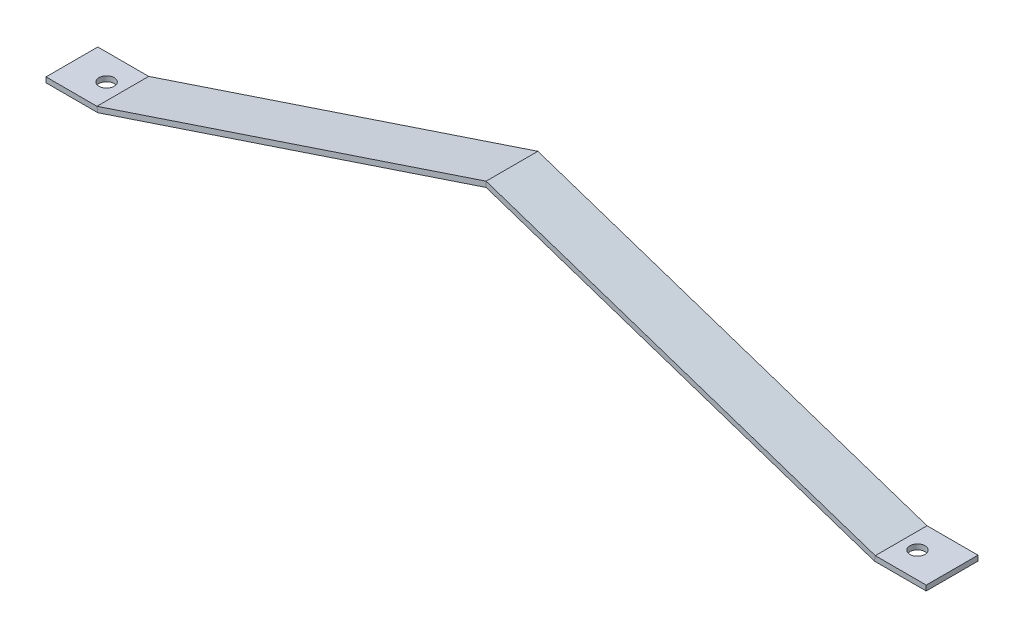
ISO-10303-21;
HEADER;
FILE_DESCRIPTION(('STEP AP214'),'2;1');
FILE_NAME('part.step','',(''),(''),'','','');
FILE_SCHEMA(('AUTOMOTIVE_DESIGN { 1 0 10303 214 1 1 1 1 }'));
ENDSEC;
DATA;
#1=APPLICATION_CONTEXT('core data for automotive mechanical design processes');
#2=APPLICATION_PROTOCOL_DEFINITION('international standard','automotive_design',2000,#1);
#3=PRODUCT_CONTEXT('',#1,'mechanical');
#4=PRODUCT('Part','Part','',(#3));
#5=PRODUCT_RELATED_PRODUCT_CATEGORY('part','',(#4));
#6=PRODUCT_DEFINITION_FORMATION('','',#4);
#7=PRODUCT_DEFINITION_CONTEXT('part definition',#1,'design');
#8=PRODUCT_DEFINITION('design','',#6,#7);
#9=PRODUCT_DEFINITION_SHAPE('','',#8);
#10=(LENGTH_UNIT() NAMED_UNIT(*) SI_UNIT(.MILLI.,.METRE.));
#11=(NAMED_UNIT(*) PLANE_ANGLE_UNIT() SI_UNIT($,.RADIAN.));
#12=(NAMED_UNIT(*) SI_UNIT($,.STERADIAN.) SOLID_ANGLE_UNIT());
#13=UNCERTAINTY_MEASURE_WITH_UNIT(LENGTH_MEASURE(1.E-05),#10,'distance_accuracy_value','');
#14=(GEOMETRIC_REPRESENTATION_CONTEXT(3) GLOBAL_UNCERTAINTY_ASSIGNED_CONTEXT((#13)) GLOBAL_UNIT_ASSIGNED_CONTEXT((#10,
#11,#12)) REPRESENTATION_CONTEXT('',''));
#15=CARTESIAN_POINT('',(0.,0.,0.));
#16=DIRECTION('',(0.,0.,1.));
#17=DIRECTION('',(1.,0.,0.));
#18=AXIS2_PLACEMENT_3D('',#15,#16,#17);
#19=CARTESIAN_POINT('',(-40.6812185256828,0.253999999999998,0.));
#20=DIRECTION('',(0.,-1.,0.));
#21=DIRECTION('',(1.,0.,0.));
#22=AXIS2_PLACEMENT_3D('',#19,#20,#21);
#23=PLANE('',#22);
#24=CARTESIAN_POINT('',(-41.4782,0.253999999999998,-1.27));
#25=DIRECTION('',(0.,-1.,0.));
#26=DIRECTION('',(1.,0.,0.));
#27=AXIS2_PLACEMENT_3D('',#24,#25,#26);
#28=CIRCLE('',#27,0.370839999999997);
#29=CARTESIAN_POINT('',(-41.10736,0.253999999999998,-1.27));
#30=VERTEX_POINT('',#29);
#31=EDGE_CURVE('E319',#30,#30,#28,.T.);
#32=ORIENTED_EDGE('',*,*,#31,.T.);
#33=EDGE_LOOP('',(#32));
#34=FACE_BOUND('',#33,.T.);
#35=DIRECTION('',(0.,0.,-1.));
#36=VECTOR('',#35,1.);
#37=CARTESIAN_POINT('',(-43.18,0.253999999999998,0.));
#38=LINE('',#37,#36);
#39=CARTESIAN_POINT('',(-43.18,0.253999999999999,0.));
#40=VERTEX_POINT('',#39);
#41=CARTESIAN_POINT('',(-43.18,0.253999999999998,-2.54));
#42=VERTEX_POINT('',#41);
#43=EDGE_CURVE('E46',#40,#42,#38,.T.);
#44=ORIENTED_EDGE('',*,*,#43,.F.);
#45=DIRECTION('',(-1.,0.,0.));
#46=VECTOR('',#45,1.);
#47=CARTESIAN_POINT('',(-40.6812185256828,0.253999999999999,0.));
#48=LINE('',#47,#46);
#49=CARTESIAN_POINT('',(-40.6812185256828,0.253999999999999,0.));
#50=VERTEX_POINT('',#49);
#51=EDGE_CURVE('E185',#50,#40,#48,.T.);
#52=ORIENTED_EDGE('',*,*,#51,.F.);
#53=DIRECTION('',(0.,0.,1.));
#54=VECTOR('',#53,1.);
#55=CARTESIAN_POINT('',(-40.6812185256828,0.253999999999998,0.));
#56=LINE('',#55,#54);
#57=CARTESIAN_POINT('',(-40.6812185256828,0.253999999999998,-2.54));
#58=VERTEX_POINT('',#57);
#59=EDGE_CURVE('E181',#58,#50,#56,.T.);
#60=ORIENTED_EDGE('',*,*,#59,.F.);
#61=DIRECTION('',(-1.,0.,0.));
#62=VECTOR('',#61,1.);
#63=CARTESIAN_POINT('',(-40.6812185256828,0.253999999999998,-2.54));
#64=LINE('',#63,#62);
#65=EDGE_CURVE('E194',#58,#42,#64,.T.);
#66=ORIENTED_EDGE('',*,*,#65,.T.);
#67=EDGE_LOOP('',(#44,#52,#60,#66));
#68=FACE_BOUND('',#67,.T.);
#69=ADVANCED_FACE('F37',(#34,#68),#23,.F.);
#70=CARTESIAN_POINT('',(-40.0879069353081,-3.40215075888503,0.));
#71=DIRECTION('',(0.,0.,-1.));
#72=DIRECTION('',(-1.,0.,0.));
#73=AXIS2_PLACEMENT_3D('',#70,#71,#72);
#74=PLANE('',#73);
#75=DIRECTION('',(0.,1.,0.));
#76=VECTOR('',#75,1.);
#77=CARTESIAN_POINT('',(-43.18,-3.40215075888503,0.));
#78=LINE('',#77,#76);
#79=CARTESIAN_POINT('',(-43.18,0.,0.));
#80=VERTEX_POINT('',#79);
#81=EDGE_CURVE('E200',#80,#40,#78,.T.);
#82=ORIENTED_EDGE('',*,*,#81,.F.);
#83=DIRECTION('',(-1.,0.,0.));
#84=VECTOR('',#83,1.);
#85=CARTESIAN_POINT('',(-40.64,0.,0.));
#86=LINE('',#85,#84);
#87=CARTESIAN_POINT('',(-40.64,0.,0.));
#88=VERTEX_POINT('',#87);
#89=EDGE_CURVE('E188',#88,#80,#86,.T.);
#90=ORIENTED_EDGE('',*,*,#89,.F.);
#91=DIRECTION('',(0.160182243006967,-0.987087457637497,0.));
#92=VECTOR('',#91,1.);
#93=CARTESIAN_POINT('',(-40.0879069353081,-3.40215075888503,0.));
#94=LINE('',#93,#92);
#95=EDGE_CURVE('E184',#50,#88,#94,.T.);
#96=ORIENTED_EDGE('',*,*,#95,.F.);
#97=ORIENTED_EDGE('',*,*,#51,.T.);
#98=EDGE_LOOP('',(#82,#90,#96,#97));
#99=FACE_BOUND('',#98,.T.);
#100=ADVANCED_FACE('F256',(#99),#74,.F.);
#101=CARTESIAN_POINT('',(-40.64,0.,0.));
#102=DIRECTION('',(0.,1.,0.));
#103=DIRECTION('',(-1.,0.,0.));
#104=AXIS2_PLACEMENT_3D('',#101,#102,#103);
#105=PLANE('',#104);
#106=CARTESIAN_POINT('',(-41.4782,0.,-1.27));
#107=DIRECTION('',(0.,-1.,0.));
#108=DIRECTION('',(0.,0.,-1.));
#109=AXIS2_PLACEMENT_3D('',#106,#107,#108);
#110=CIRCLE('',#109,0.370839999999997);
#111=CARTESIAN_POINT('',(-41.4782,0.,-1.64084));
#112=VERTEX_POINT('',#111);
#113=EDGE_CURVE('E317',#112,#112,#110,.T.);
#114=ORIENTED_EDGE('',*,*,#113,.F.);
#115=EDGE_LOOP('',(#114));
#116=FACE_BOUND('',#115,.T.);
#117=DIRECTION('',(0.,0.,1.));
#118=VECTOR('',#117,1.);
#119=CARTESIAN_POINT('',(-43.18,0.,0.));
#120=LINE('',#119,#118);
#121=CARTESIAN_POINT('',(-43.18,0.,-2.54));
#122=VERTEX_POINT('',#121);
#123=EDGE_CURVE('E196',#122,#80,#120,.T.);
#124=ORIENTED_EDGE('',*,*,#123,.F.);
#125=DIRECTION('',(-1.,0.,0.));
#126=VECTOR('',#125,1.);
#127=CARTESIAN_POINT('',(-40.64,0.,-2.54));
#128=LINE('',#127,#126);
#129=CARTESIAN_POINT('',(-40.64,0.,-2.54));
#130=VERTEX_POINT('',#129);
#131=EDGE_CURVE('E192',#130,#122,#128,.T.);
#132=ORIENTED_EDGE('',*,*,#131,.F.);
#133=DIRECTION('',(0.,0.,-1.));
#134=VECTOR('',#133,1.);
#135=CARTESIAN_POINT('',(-40.64,0.,0.));
#136=LINE('',#135,#134);
#137=EDGE_CURVE('E209',#88,#130,#136,.T.);
#138=ORIENTED_EDGE('',*,*,#137,.F.);
#139=ORIENTED_EDGE('',*,*,#89,.T.);
#140=EDGE_LOOP('',(#124,#132,#138,#139));
#141=FACE_BOUND('',#140,.T.);
#142=ADVANCED_FACE('F258',(#116,#141),#105,.F.);
#143=CARTESIAN_POINT('',(-40.0879069353081,-3.40215075888503,-2.54));
#144=DIRECTION('',(0.,0.,1.));
#145=DIRECTION('',(1.,0.,0.));
#146=AXIS2_PLACEMENT_3D('',#143,#144,#145);
#147=PLANE('',#146);
#148=DIRECTION('',(0.,-1.,0.));
#149=VECTOR('',#148,1.);
#150=CARTESIAN_POINT('',(-43.18,-3.40215075888503,-2.54));
#151=LINE('',#150,#149);
#152=EDGE_CURVE('E12',#42,#122,#151,.T.);
#153=ORIENTED_EDGE('',*,*,#152,.F.);
#154=ORIENTED_EDGE('',*,*,#65,.F.);
#155=DIRECTION('',(-0.160182243006967,0.987087457637497,0.));
#156=VECTOR('',#155,1.);
#157=CARTESIAN_POINT('',(-40.0879069353081,-3.40215075888503,-2.54));
#158=LINE('',#157,#156);
#159=EDGE_CURVE('E189',#130,#58,#158,.T.);
#160=ORIENTED_EDGE('',*,*,#159,.F.);
#161=ORIENTED_EDGE('',*,*,#131,.T.);
#162=EDGE_LOOP('',(#153,#154,#160,#161));
#163=FACE_BOUND('',#162,.T.);
#164=ADVANCED_FACE('F39',(#163),#147,.F.);
#165=CARTESIAN_POINT('',(-21.59,-0.400353703410804,0.));
#166=DIRECTION('',(0.,0.,1.));
#167=DIRECTION('',(1.,0.,0.));
#168=AXIS2_PLACEMENT_3D('',#165,#166,#167);
#169=PLANE('',#168);
#170=DIRECTION('',(-0.948683298050514,-0.316227766016838,0.));
#171=VECTOR('',#170,1.);
#172=CARTESIAN_POINT('',(-21.59,6.61773950856092,0.));
#173=LINE('',#172,#171);
#174=CARTESIAN_POINT('',(-21.59,6.61773950856092,0.));
#175=VERTEX_POINT('',#174);
#176=EDGE_CURVE('E178',#175,#50,#173,.T.);
#177=ORIENTED_EDGE('',*,*,#176,.T.);
#178=ORIENTED_EDGE('',*,*,#95,.T.);
#179=DIRECTION('',(-0.948683298050514,-0.316227766016838,0.));
#180=VECTOR('',#179,1.);
#181=CARTESIAN_POINT('',(-21.59,6.35,0.));
#182=LINE('',#181,#180);
#183=CARTESIAN_POINT('',(-21.59,6.35,0.));
#184=VERTEX_POINT('',#183);
#185=EDGE_CURVE('E168',#184,#88,#182,.T.);
#186=ORIENTED_EDGE('',*,*,#185,.F.);
#187=DIRECTION('',(0.,1.,0.));
#188=VECTOR('',#187,1.);
#189=CARTESIAN_POINT('',(-21.59,-0.400353703410804,0.));
#190=LINE('',#189,#188);
#191=EDGE_CURVE('E169',#184,#175,#190,.T.);
#192=ORIENTED_EDGE('',*,*,#191,.T.);
#193=EDGE_LOOP('',(#177,#178,#186,#192));
#194=FACE_BOUND('',#193,.T.);
#195=ADVANCED_FACE('F245',(#194),#169,.T.);
#196=CARTESIAN_POINT('',(-21.59,6.35,0.));
#197=DIRECTION('',(0.316227766016838,-0.948683298050514,0.));
#198=DIRECTION('',(0.948683298050514,0.316227766016838,0.));
#199=AXIS2_PLACEMENT_3D('',#196,#197,#198);
#200=PLANE('',#199);
#201=ORIENTED_EDGE('',*,*,#185,.T.);
#202=ORIENTED_EDGE('',*,*,#137,.T.);
#203=DIRECTION('',(-0.948683298050514,-0.316227766016838,0.));
#204=VECTOR('',#203,1.);
#205=CARTESIAN_POINT('',(-21.59,6.35,-2.54));
#206=LINE('',#205,#204);
#207=CARTESIAN_POINT('',(-21.59,6.35,-2.54));
#208=VERTEX_POINT('',#207);
#209=EDGE_CURVE('E172',#208,#130,#206,.T.);
#210=ORIENTED_EDGE('',*,*,#209,.F.);
#211=DIRECTION('',(0.,0.,1.));
#212=VECTOR('',#211,1.);
#213=CARTESIAN_POINT('',(-21.59,6.35,0.));
#214=LINE('',#213,#212);
#215=EDGE_CURVE('E216',#208,#184,#214,.T.);
#216=ORIENTED_EDGE('',*,*,#215,.T.);
#217=EDGE_LOOP('',(#201,#202,#210,#216));
#218=FACE_BOUND('',#217,.T.);
#219=ADVANCED_FACE('F248',(#218),#200,.T.);
#220=CARTESIAN_POINT('',(-21.59,-0.400353703410804,-2.54));
#221=DIRECTION('',(0.,0.,-1.));
#222=DIRECTION('',(-1.,0.,0.));
#223=AXIS2_PLACEMENT_3D('',#220,#221,#222);
#224=PLANE('',#223);
#225=ORIENTED_EDGE('',*,*,#209,.T.);
#226=ORIENTED_EDGE('',*,*,#159,.T.);
#227=DIRECTION('',(-0.948683298050514,-0.316227766016838,0.));
#228=VECTOR('',#227,1.);
#229=CARTESIAN_POINT('',(-21.59,6.61773950856092,-2.54));
#230=LINE('',#229,#228);
#231=CARTESIAN_POINT('',(-21.59,6.61773950856092,-2.54));
#232=VERTEX_POINT('',#231);
#233=EDGE_CURVE('E175',#232,#58,#230,.T.);
#234=ORIENTED_EDGE('',*,*,#233,.F.);
#235=DIRECTION('',(0.,-1.,0.));
#236=VECTOR('',#235,1.);
#237=CARTESIAN_POINT('',(-21.59,-0.400353703410804,-2.54));
#238=LINE('',#237,#236);
#239=EDGE_CURVE('E164',#232,#208,#238,.T.);
#240=ORIENTED_EDGE('',*,*,#239,.T.);
#241=EDGE_LOOP('',(#225,#226,#234,#240));
#242=FACE_BOUND('',#241,.T.);
#243=ADVANCED_FACE('F251',(#242),#224,.T.);
#244=CARTESIAN_POINT('',(-21.59,6.61773950856092,0.));
#245=DIRECTION('',(-0.316227766016838,0.948683298050514,0.));
#246=DIRECTION('',(-0.948683298050514,-0.316227766016838,0.));
#247=AXIS2_PLACEMENT_3D('',#244,#245,#246);
#248=PLANE('',#247);
#249=ORIENTED_EDGE('',*,*,#233,.T.);
#250=ORIENTED_EDGE('',*,*,#59,.T.);
#251=ORIENTED_EDGE('',*,*,#176,.F.);
#252=DIRECTION('',(0.,0.,-1.));
#253=VECTOR('',#252,1.);
#254=CARTESIAN_POINT('',(-21.59,6.61773950856092,0.));
#255=LINE('',#254,#253);
#256=EDGE_CURVE('E165',#175,#232,#255,.T.);
#257=ORIENTED_EDGE('',*,*,#256,.T.);
#258=EDGE_LOOP('',(#249,#250,#251,#257));
#259=FACE_BOUND('',#258,.T.);
#260=ADVANCED_FACE('F254',(#259),#248,.T.);
#261=CARTESIAN_POINT('',(-2.60496846222925,-0.400353703410803,0.));
#262=DIRECTION('',(0.,0.,-1.));
#263=DIRECTION('',(-1.,0.,0.));
#264=AXIS2_PLACEMENT_3D('',#261,#262,#263);
#265=PLANE('',#264);
#266=ORIENTED_EDGE('',*,*,#191,.F.);
#267=DIRECTION('',(-0.948683298050514,0.316227766016838,0.));
#268=VECTOR('',#267,1.);
#269=CARTESIAN_POINT('',(-2.54,0.,0.));
#270=LINE('',#269,#268);
#271=CARTESIAN_POINT('',(-2.54,0.,0.));
#272=VERTEX_POINT('',#271);
#273=EDGE_CURVE('E151',#272,#184,#270,.T.);
#274=ORIENTED_EDGE('',*,*,#273,.F.);
#275=DIRECTION('',(-0.160182243006967,-0.987087457637497,0.));
#276=VECTOR('',#275,1.);
#277=CARTESIAN_POINT('',(-2.60496846222925,-0.400353703410803,0.));
#278=LINE('',#277,#276);
#279=CARTESIAN_POINT('',(-2.49878147431723,0.254,0.));
#280=VERTEX_POINT('',#279);
#281=EDGE_CURVE('E117',#280,#272,#278,.T.);
#282=ORIENTED_EDGE('',*,*,#281,.F.);
#283=DIRECTION('',(-0.948683298050514,0.316227766016838,0.));
#284=VECTOR('',#283,1.);
#285=CARTESIAN_POINT('',(-2.49878147431723,0.254,0.));
#286=LINE('',#285,#284);
#287=EDGE_CURVE('E161',#280,#175,#286,.T.);
#288=ORIENTED_EDGE('',*,*,#287,.T.);
#289=EDGE_LOOP('',(#266,#274,#282,#288));
#290=FACE_BOUND('',#289,.T.);
#291=ADVANCED_FACE('F243',(#290),#265,.F.);
#292=CARTESIAN_POINT('',(-2.54,0.,0.));
#293=DIRECTION('',(0.316227766016838,0.948683298050514,0.));
#294=DIRECTION('',(-0.948683298050514,0.316227766016838,0.));
#295=AXIS2_PLACEMENT_3D('',#292,#293,#294);
#296=PLANE('',#295);
#297=ORIENTED_EDGE('',*,*,#215,.F.);
#298=DIRECTION('',(-0.948683298050514,0.316227766016838,0.));
#299=VECTOR('',#298,1.);
#300=CARTESIAN_POINT('',(-2.54,0.,-2.54));
#301=LINE('',#300,#299);
#302=CARTESIAN_POINT('',(-2.54,0.,-2.54));
#303=VERTEX_POINT('',#302);
#304=EDGE_CURVE('E154',#303,#208,#301,.T.);
#305=ORIENTED_EDGE('',*,*,#304,.F.);
#306=DIRECTION('',(0.,0.,-1.));
#307=VECTOR('',#306,1.);
#308=CARTESIAN_POINT('',(-2.54,0.,0.));
#309=LINE('',#308,#307);
#310=EDGE_CURVE('E140',#272,#303,#309,.T.);
#311=ORIENTED_EDGE('',*,*,#310,.F.);
#312=ORIENTED_EDGE('',*,*,#273,.T.);
#313=EDGE_LOOP('',(#297,#305,#311,#312));
#314=FACE_BOUND('',#313,.T.);
#315=ADVANCED_FACE('F229',(#314),#296,.F.);
#316=CARTESIAN_POINT('',(-2.60496846222925,-0.400353703410803,-2.54));
#317=DIRECTION('',(0.,0.,1.));
#318=DIRECTION('',(1.,0.,0.));
#319=AXIS2_PLACEMENT_3D('',#316,#317,#318);
#320=PLANE('',#319);
#321=ORIENTED_EDGE('',*,*,#239,.F.);
#322=DIRECTION('',(-0.948683298050514,0.316227766016838,0.));
#323=VECTOR('',#322,1.);
#324=CARTESIAN_POINT('',(-2.49878147431723,0.254,-2.54));
#325=LINE('',#324,#323);
#326=CARTESIAN_POINT('',(-2.49878147431723,0.254,-2.54));
#327=VERTEX_POINT('',#326);
#328=EDGE_CURVE('E158',#327,#232,#325,.T.);
#329=ORIENTED_EDGE('',*,*,#328,.F.);
#330=DIRECTION('',(0.160182243006967,0.987087457637497,0.));
#331=VECTOR('',#330,1.);
#332=CARTESIAN_POINT('',(-2.60496846222925,-0.400353703410803,-2.54));
#333=LINE('',#332,#331);
#334=EDGE_CURVE('E222',#303,#327,#333,.T.);
#335=ORIENTED_EDGE('',*,*,#334,.F.);
#336=ORIENTED_EDGE('',*,*,#304,.T.);
#337=EDGE_LOOP('',(#321,#329,#335,#336));
#338=FACE_BOUND('',#337,.T.);
#339=ADVANCED_FACE('F232',(#338),#320,.F.);
#340=CARTESIAN_POINT('',(-2.49878147431723,0.254,0.));
#341=DIRECTION('',(-0.316227766016838,-0.948683298050514,0.));
#342=DIRECTION('',(0.948683298050514,-0.316227766016838,0.));
#343=AXIS2_PLACEMENT_3D('',#340,#341,#342);
#344=PLANE('',#343);
#345=ORIENTED_EDGE('',*,*,#256,.F.);
#346=ORIENTED_EDGE('',*,*,#287,.F.);
#347=DIRECTION('',(0.,0.,1.));
#348=VECTOR('',#347,1.);
#349=CARTESIAN_POINT('',(-2.49878147431723,0.254,0.));
#350=LINE('',#349,#348);
#351=EDGE_CURVE('E155',#327,#280,#350,.T.);
#352=ORIENTED_EDGE('',*,*,#351,.F.);
#353=ORIENTED_EDGE('',*,*,#328,.T.);
#354=EDGE_LOOP('',(#345,#346,#352,#353));
#355=FACE_BOUND('',#354,.T.);
#356=ADVANCED_FACE('F240',(#355),#344,.F.);
#357=CARTESIAN_POINT('',(0.,0.,0.));
#358=DIRECTION('',(-1.,0.,0.));
#359=DIRECTION('',(0.,0.,1.));
#360=AXIS2_PLACEMENT_3D('',#357,#358,#359);
#361=PLANE('',#360);
#362=DIRECTION('',(0.,-1.,0.));
#363=VECTOR('',#362,1.);
#364=CARTESIAN_POINT('',(0.,0.,0.));
#365=LINE('',#364,#363);
#366=CARTESIAN_POINT('',(0.,0.254,0.));
#367=VERTEX_POINT('',#366);
#368=CARTESIAN_POINT('',(0.,0.,0.));
#369=VERTEX_POINT('',#368);
#370=EDGE_CURVE('E114',#367,#369,#365,.T.);
#371=ORIENTED_EDGE('',*,*,#370,.T.);
#372=DIRECTION('',(0.,0.,-1.));
#373=VECTOR('',#372,1.);
#374=CARTESIAN_POINT('',(0.,0.,0.));
#375=LINE('',#374,#373);
#376=CARTESIAN_POINT('',(0.,0.,-2.54));
#377=VERTEX_POINT('',#376);
#378=EDGE_CURVE('E124',#369,#377,#375,.T.);
#379=ORIENTED_EDGE('',*,*,#378,.T.);
#380=DIRECTION('',(0.,1.,0.));
#381=VECTOR('',#380,1.);
#382=CARTESIAN_POINT('',(0.,0.,-2.54));
#383=LINE('',#382,#381);
#384=CARTESIAN_POINT('',(0.,0.254,-2.54));
#385=VERTEX_POINT('',#384);
#386=EDGE_CURVE('E130',#377,#385,#383,.T.);
#387=ORIENTED_EDGE('',*,*,#386,.T.);
#388=DIRECTION('',(0.,0.,1.));
#389=VECTOR('',#388,1.);
#390=CARTESIAN_POINT('',(0.,0.254,0.));
#391=LINE('',#390,#389);
#392=EDGE_CURVE('E121',#385,#367,#391,.T.);
#393=ORIENTED_EDGE('',*,*,#392,.T.);
#394=EDGE_LOOP('',(#371,#379,#387,#393));
#395=FACE_BOUND('',#394,.T.);
#396=ADVANCED_FACE('F132',(#395),#361,.F.);
#397=CARTESIAN_POINT('',(-5.07205914492332,0.,0.));
#398=DIRECTION('',(0.,0.,1.));
#399=DIRECTION('',(1.,0.,0.));
#400=AXIS2_PLACEMENT_3D('',#397,#398,#399);
#401=PLANE('',#400);
#402=DIRECTION('',(1.,0.,0.));
#403=VECTOR('',#402,1.);
#404=CARTESIAN_POINT('',(-5.07205914492332,0.254,0.));
#405=LINE('',#404,#403);
#406=EDGE_CURVE('E145',#280,#367,#405,.T.);
#407=ORIENTED_EDGE('',*,*,#406,.F.);
#408=ORIENTED_EDGE('',*,*,#281,.T.);
#409=DIRECTION('',(1.,0.,0.));
#410=VECTOR('',#409,1.);
#411=CARTESIAN_POINT('',(-5.07205914492332,0.,0.));
#412=LINE('',#411,#410);
#413=EDGE_CURVE('E109',#272,#369,#412,.T.);
#414=ORIENTED_EDGE('',*,*,#413,.T.);
#415=ORIENTED_EDGE('',*,*,#370,.F.);
#416=EDGE_LOOP('',(#407,#408,#414,#415));
#417=FACE_BOUND('',#416,.T.);
#418=ADVANCED_FACE('F112',(#417),#401,.T.);
#419=CARTESIAN_POINT('',(-5.07205914492332,0.254,0.));
#420=DIRECTION('',(0.,1.,0.));
#421=DIRECTION('',(-1.,0.,0.));
#422=AXIS2_PLACEMENT_3D('',#419,#420,#421);
#423=PLANE('',#422);
#424=CARTESIAN_POINT('',(-1.7018,0.254,-1.27));
#425=DIRECTION('',(0.,1.,0.));
#426=DIRECTION('',(-1.,0.,0.));
#427=AXIS2_PLACEMENT_3D('',#424,#425,#426);
#428=CIRCLE('',#427,0.370839999999999);
#429=CARTESIAN_POINT('',(-2.07264,0.254,-1.27));
#430=VERTEX_POINT('',#429);
#431=EDGE_CURVE('E134',#430,#430,#428,.T.);
#432=ORIENTED_EDGE('',*,*,#431,.F.);
#433=EDGE_LOOP('',(#432));
#434=FACE_BOUND('',#433,.T.);
#435=DIRECTION('',(1.,0.,0.));
#436=VECTOR('',#435,1.);
#437=CARTESIAN_POINT('',(-5.07205914492332,0.254,-2.54));
#438=LINE('',#437,#436);
#439=EDGE_CURVE('E147',#327,#385,#438,.T.);
#440=ORIENTED_EDGE('',*,*,#439,.F.);
#441=ORIENTED_EDGE('',*,*,#351,.T.);
#442=ORIENTED_EDGE('',*,*,#406,.T.);
#443=ORIENTED_EDGE('',*,*,#392,.F.);
#444=EDGE_LOOP('',(#440,#441,#442,#443));
#445=FACE_BOUND('',#444,.T.);
#446=ADVANCED_FACE('F237',(#434,#445),#423,.T.);
#447=CARTESIAN_POINT('',(-5.07205914492332,0.,-2.54));
#448=DIRECTION('',(0.,0.,-1.));
#449=DIRECTION('',(-1.,0.,0.));
#450=AXIS2_PLACEMENT_3D('',#447,#448,#449);
#451=PLANE('',#450);
#452=DIRECTION('',(1.,0.,0.));
#453=VECTOR('',#452,1.);
#454=CARTESIAN_POINT('',(-5.07205914492332,0.,-2.54));
#455=LINE('',#454,#453);
#456=EDGE_CURVE('E120',#303,#377,#455,.T.);
#457=ORIENTED_EDGE('',*,*,#456,.F.);
#458=ORIENTED_EDGE('',*,*,#334,.T.);
#459=ORIENTED_EDGE('',*,*,#439,.T.);
#460=ORIENTED_EDGE('',*,*,#386,.F.);
#461=EDGE_LOOP('',(#457,#458,#459,#460));
#462=FACE_BOUND('',#461,.T.);
#463=ADVANCED_FACE('F234',(#462),#451,.T.);
#464=CARTESIAN_POINT('',(-5.07205914492332,0.,0.));
#465=DIRECTION('',(0.,-1.,0.));
#466=DIRECTION('',(1.,0.,0.));
#467=AXIS2_PLACEMENT_3D('',#464,#465,#466);
#468=PLANE('',#467);
#469=CARTESIAN_POINT('',(-1.7018,0.,-1.27));
#470=DIRECTION('',(0.,-1.,0.));
#471=DIRECTION('',(0.,0.,-1.));
#472=AXIS2_PLACEMENT_3D('',#469,#470,#471);
#473=CIRCLE('',#472,0.370839999999999);
#474=CARTESIAN_POINT('',(-1.7018,0.,-1.64084));
#475=VERTEX_POINT('',#474);
#476=EDGE_CURVE('E137',#475,#475,#473,.T.);
#477=ORIENTED_EDGE('',*,*,#476,.F.);
#478=EDGE_LOOP('',(#477));
#479=FACE_BOUND('',#478,.T.);
#480=ORIENTED_EDGE('',*,*,#413,.F.);
#481=ORIENTED_EDGE('',*,*,#310,.T.);
#482=ORIENTED_EDGE('',*,*,#456,.T.);
#483=ORIENTED_EDGE('',*,*,#378,.F.);
#484=EDGE_LOOP('',(#480,#481,#482,#483));
#485=FACE_BOUND('',#484,.T.);
#486=ADVANCED_FACE('F125',(#479,#485),#468,.T.);
#487=CARTESIAN_POINT('',(-43.18,0.126999999999999,-1.27));
#488=DIRECTION('',(-1.,0.,0.));
#489=DIRECTION('',(0.,-1.,0.));
#490=AXIS2_PLACEMENT_3D('',#487,#488,#489);
#491=PLANE('',#490);
#492=ORIENTED_EDGE('',*,*,#43,.T.);
#493=ORIENTED_EDGE('',*,*,#152,.T.);
#494=ORIENTED_EDGE('',*,*,#123,.T.);
#495=ORIENTED_EDGE('',*,*,#81,.T.);
#496=EDGE_LOOP('',(#492,#493,#494,#495));
#497=FACE_BOUND('',#496,.T.);
#498=ADVANCED_FACE('F294',(#497),#491,.T.);
#499=CARTESIAN_POINT('',(-1.7018,0.,-1.27));
#500=DIRECTION('',(0.,-1.,0.));
#501=DIRECTION('',(0.,0.,-1.));
#502=AXIS2_PLACEMENT_3D('',#499,#500,#501);
#503=CYLINDRICAL_SURFACE('',#502,0.370839999999999);
#504=ORIENTED_EDGE('',*,*,#431,.T.);
#505=EDGE_LOOP('',(#504));
#506=FACE_BOUND('',#505,.T.);
#507=ORIENTED_EDGE('',*,*,#476,.T.);
#508=EDGE_LOOP('',(#507));
#509=FACE_BOUND('',#508,.T.);
#510=ADVANCED_FACE('F305',(#506,#509),#503,.F.);
#511=CARTESIAN_POINT('',(-41.4782,0.,-1.27));
#512=DIRECTION('',(0.,-1.,0.));
#513=DIRECTION('',(0.,0.,-1.));
#514=AXIS2_PLACEMENT_3D('',#511,#512,#513);
#515=CYLINDRICAL_SURFACE('',#514,0.370839999999997);
#516=ORIENTED_EDGE('',*,*,#113,.T.);
#517=EDGE_LOOP('',(#516));
#518=FACE_BOUND('',#517,.T.);
#519=ORIENTED_EDGE('',*,*,#31,.F.);
#520=EDGE_LOOP('',(#519));
#521=FACE_BOUND('',#520,.T.);
#522=ADVANCED_FACE('F308',(#518,#521),#515,.F.);
#523=CLOSED_SHELL('',(#69,#100,#142,#164,#195,#219,#243,#260,#291,#315,#339,#356,#396,#418,#446,
#463,#486,#498,#510,#522));
#524=MANIFOLD_SOLID_BREP('B2',#523);
#525=ADVANCED_BREP_SHAPE_REPRESENTATION('',(#18,#524),#14);
#526=SHAPE_DEFINITION_REPRESENTATION(#9,#525);
ENDSEC;
END-ISO-10303-21;
